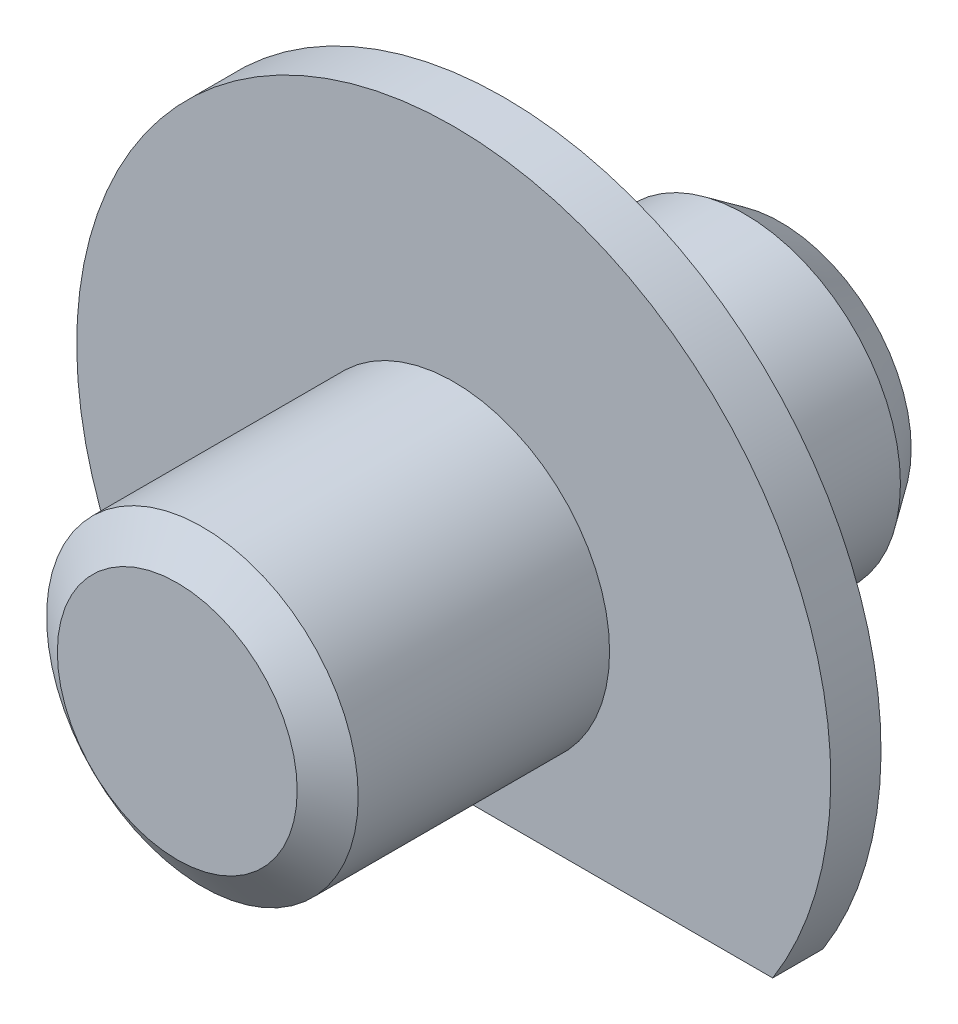
ISO-10303-21;
HEADER;
FILE_DESCRIPTION(('STEP AP214'),'2;1');
FILE_NAME('part.step','',(''),(''),'','','');
FILE_SCHEMA(('AUTOMOTIVE_DESIGN { 1 0 10303 214 1 1 1 1 }'));
ENDSEC;
DATA;
#1=APPLICATION_CONTEXT('core data for automotive mechanical design processes');
#2=APPLICATION_PROTOCOL_DEFINITION('international standard','automotive_design',2000,#1);
#3=PRODUCT_CONTEXT('',#1,'mechanical');
#4=PRODUCT('Part','Part','',(#3));
#5=PRODUCT_RELATED_PRODUCT_CATEGORY('part','',(#4));
#6=PRODUCT_DEFINITION_FORMATION('','',#4);
#7=PRODUCT_DEFINITION_CONTEXT('part definition',#1,'design');
#8=PRODUCT_DEFINITION('design','',#6,#7);
#9=PRODUCT_DEFINITION_SHAPE('','',#8);
#10=(LENGTH_UNIT() NAMED_UNIT(*) SI_UNIT(.MILLI.,.METRE.));
#11=(NAMED_UNIT(*) PLANE_ANGLE_UNIT() SI_UNIT($,.RADIAN.));
#12=(NAMED_UNIT(*) SI_UNIT($,.STERADIAN.) SOLID_ANGLE_UNIT());
#13=UNCERTAINTY_MEASURE_WITH_UNIT(LENGTH_MEASURE(1.E-05),#10,'distance_accuracy_value','');
#14=(GEOMETRIC_REPRESENTATION_CONTEXT(3) GLOBAL_UNCERTAINTY_ASSIGNED_CONTEXT((#13)) GLOBAL_UNIT_ASSIGNED_CONTEXT((#10,
#11,#12)) REPRESENTATION_CONTEXT('',''));
#15=CARTESIAN_POINT('',(0.,0.,0.));
#16=DIRECTION('',(0.,0.,1.));
#17=DIRECTION('',(1.,0.,0.));
#18=AXIS2_PLACEMENT_3D('',#15,#16,#17);
#19=CARTESIAN_POINT('',(0.,0.,12.));
#20=DIRECTION('',(0.,0.,-1.));
#21=DIRECTION('',(-1.,0.,0.));
#22=AXIS2_PLACEMENT_3D('',#19,#20,#21);
#23=CYLINDRICAL_SURFACE('',#22,3.1);
#24=CARTESIAN_POINT('',(0.,0.,0.714074003371056));
#25=DIRECTION('',(0.,0.,1.));
#26=DIRECTION('',(1.,0.,0.));
#27=AXIS2_PLACEMENT_3D('',#24,#25,#26);
#28=CIRCLE('',#27,3.1);
#29=CARTESIAN_POINT('',(3.1,0.,0.714074003371056));
#30=VERTEX_POINT('',#29);
#31=EDGE_CURVE('E85',#30,#30,#28,.T.);
#32=ORIENTED_EDGE('',*,*,#31,.T.);
#33=EDGE_LOOP('',(#32));
#34=FACE_BOUND('',#33,.T.);
#35=CARTESIAN_POINT('',(0.,0.,5.5));
#36=DIRECTION('',(0.,0.,1.));
#37=DIRECTION('',(1.,0.,0.));
#38=AXIS2_PLACEMENT_3D('',#35,#36,#37);
#39=CIRCLE('',#38,3.1);
#40=CARTESIAN_POINT('',(3.1,0.,5.5));
#41=VERTEX_POINT('',#40);
#42=EDGE_CURVE('E11',#41,#41,#39,.T.);
#43=ORIENTED_EDGE('',*,*,#42,.F.);
#44=EDGE_LOOP('',(#43));
#45=FACE_BOUND('',#44,.T.);
#46=ADVANCED_FACE('F36',(#34,#45),#23,.T.);
#47=CARTESIAN_POINT('',(0.,0.,0.));
#48=DIRECTION('',(0.,0.,1.));
#49=DIRECTION('',(1.,0.,0.));
#50=AXIS2_PLACEMENT_3D('',#47,#48,#49);
#51=PLANE('',#50);
#52=CARTESIAN_POINT('',(0.,0.,0.));
#53=DIRECTION('',(0.,0.,1.));
#54=DIRECTION('',(1.,0.,0.));
#55=AXIS2_PLACEMENT_3D('',#52,#53,#54);
#56=CIRCLE('',#55,2.6);
#57=CARTESIAN_POINT('',(2.6,0.,0.));
#58=VERTEX_POINT('',#57);
#59=EDGE_CURVE('E88',#58,#58,#56,.F.);
#60=ORIENTED_EDGE('',*,*,#59,.T.);
#61=EDGE_LOOP('',(#60));
#62=FACE_BOUND('',#61,.T.);
#63=ADVANCED_FACE('F111',(#62),#51,.F.);
#64=CARTESIAN_POINT('',(0.,0.,0.714074003371056));
#65=DIRECTION('',(0.,0.,1.));
#66=DIRECTION('',(1.,0.,0.));
#67=AXIS2_PLACEMENT_3D('',#64,#65,#66);
#68=CONICAL_SURFACE('',#67,3.1,0.610865238198017);
#69=ORIENTED_EDGE('',*,*,#59,.F.);
#70=EDGE_LOOP('',(#69));
#71=FACE_BOUND('',#70,.T.);
#72=ORIENTED_EDGE('',*,*,#31,.F.);
#73=EDGE_LOOP('',(#72));
#74=FACE_BOUND('',#73,.T.);
#75=ADVANCED_FACE('F117',(#71,#74),#68,.T.);
#76=CARTESIAN_POINT('',(0.,0.,5.5));
#77=DIRECTION('',(0.,0.,1.));
#78=DIRECTION('',(1.,0.,0.));
#79=AXIS2_PLACEMENT_3D('',#76,#77,#78);
#80=CYLINDRICAL_SURFACE('',#79,7.5);
#81=DIRECTION('',(0.,0.,1.));
#82=VECTOR('',#81,1.);
#83=CARTESIAN_POINT('',(-6.34428877022476,-4.,5.5));
#84=LINE('',#83,#82);
#85=CARTESIAN_POINT('',(-6.34428877022476,-4.,5.5));
#86=VERTEX_POINT('',#85);
#87=CARTESIAN_POINT('',(-6.34428877022476,-4.,6.5));
#88=VERTEX_POINT('',#87);
#89=EDGE_CURVE('E59',#86,#88,#84,.T.);
#90=ORIENTED_EDGE('',*,*,#89,.T.);
#91=CARTESIAN_POINT('',(0.,0.,6.5));
#92=DIRECTION('',(0.,0.,1.));
#93=DIRECTION('',(1.,0.,0.));
#94=AXIS2_PLACEMENT_3D('',#91,#92,#93);
#95=CIRCLE('',#94,7.5);
#96=CARTESIAN_POINT('',(6.34428877022476,-4.,6.5));
#97=VERTEX_POINT('',#96);
#98=EDGE_CURVE('E65',#97,#88,#95,.T.);
#99=ORIENTED_EDGE('',*,*,#98,.F.);
#100=DIRECTION('',(0.,0.,1.));
#101=VECTOR('',#100,1.);
#102=CARTESIAN_POINT('',(6.34428877022476,-4.,5.5));
#103=LINE('',#102,#101);
#104=CARTESIAN_POINT('',(6.34428877022476,-4.,5.5));
#105=VERTEX_POINT('',#104);
#106=EDGE_CURVE('E51',#105,#97,#103,.T.);
#107=ORIENTED_EDGE('',*,*,#106,.F.);
#108=CARTESIAN_POINT('',(0.,0.,5.5));
#109=DIRECTION('',(0.,0.,1.));
#110=DIRECTION('',(1.,0.,0.));
#111=AXIS2_PLACEMENT_3D('',#108,#109,#110);
#112=CIRCLE('',#111,7.5);
#113=EDGE_CURVE('E66',#105,#86,#112,.T.);
#114=ORIENTED_EDGE('',*,*,#113,.T.);
#115=EDGE_LOOP('',(#90,#99,#107,#114));
#116=FACE_BOUND('',#115,.T.);
#117=ADVANCED_FACE('F63',(#116),#80,.T.);
#118=CARTESIAN_POINT('',(-6.34428877022476,-4.,5.5));
#119=DIRECTION('',(0.,-1.,0.));
#120=DIRECTION('',(0.,0.,-1.));
#121=AXIS2_PLACEMENT_3D('',#118,#119,#120);
#122=PLANE('',#121);
#123=ORIENTED_EDGE('',*,*,#106,.T.);
#124=DIRECTION('',(1.,0.,0.));
#125=VECTOR('',#124,1.);
#126=CARTESIAN_POINT('',(-6.34428877022476,-4.,6.5));
#127=LINE('',#126,#125);
#128=EDGE_CURVE('E71',#88,#97,#127,.T.);
#129=ORIENTED_EDGE('',*,*,#128,.F.);
#130=ORIENTED_EDGE('',*,*,#89,.F.);
#131=DIRECTION('',(1.,0.,0.));
#132=VECTOR('',#131,1.);
#133=CARTESIAN_POINT('',(-6.34428877022476,-4.,5.5));
#134=LINE('',#133,#132);
#135=EDGE_CURVE('E68',#86,#105,#134,.T.);
#136=ORIENTED_EDGE('',*,*,#135,.T.);
#137=EDGE_LOOP('',(#123,#129,#130,#136));
#138=FACE_BOUND('',#137,.T.);
#139=ADVANCED_FACE('F72',(#138),#122,.T.);
#140=CARTESIAN_POINT('',(0.,0.,5.5));
#141=DIRECTION('',(0.,0.,1.));
#142=DIRECTION('',(1.,0.,0.));
#143=AXIS2_PLACEMENT_3D('',#140,#141,#142);
#144=PLANE('',#143);
#145=ORIENTED_EDGE('',*,*,#42,.T.);
#146=EDGE_LOOP('',(#145));
#147=FACE_BOUND('',#146,.T.);
#148=ORIENTED_EDGE('',*,*,#113,.F.);
#149=ORIENTED_EDGE('',*,*,#135,.F.);
#150=EDGE_LOOP('',(#148,#149));
#151=FACE_BOUND('',#150,.T.);
#152=ADVANCED_FACE('F100',(#147,#151),#144,.F.);
#153=CARTESIAN_POINT('',(0.,0.,6.5));
#154=DIRECTION('',(0.,0.,1.));
#155=DIRECTION('',(1.,0.,0.));
#156=AXIS2_PLACEMENT_3D('',#153,#154,#155);
#157=PLANE('',#156);
#158=CARTESIAN_POINT('',(0.,0.,6.5));
#159=DIRECTION('',(0.,0.,1.));
#160=DIRECTION('',(1.,0.,0.));
#161=AXIS2_PLACEMENT_3D('',#158,#159,#160);
#162=CIRCLE('',#161,3.1);
#163=CARTESIAN_POINT('',(3.1,0.,6.5));
#164=VERTEX_POINT('',#163);
#165=EDGE_CURVE('E80',#164,#164,#162,.T.);
#166=ORIENTED_EDGE('',*,*,#165,.F.);
#167=EDGE_LOOP('',(#166));
#168=FACE_BOUND('',#167,.T.);
#169=ORIENTED_EDGE('',*,*,#98,.T.);
#170=ORIENTED_EDGE('',*,*,#128,.T.);
#171=EDGE_LOOP('',(#169,#170));
#172=FACE_BOUND('',#171,.T.);
#173=ADVANCED_FACE('F75',(#168,#172),#157,.T.);
#174=CARTESIAN_POINT('',(0.,0.,12.));
#175=DIRECTION('',(0.,0.,1.));
#176=DIRECTION('',(1.,0.,0.));
#177=AXIS2_PLACEMENT_3D('',#174,#175,#176);
#178=PLANE('',#177);
#179=CARTESIAN_POINT('',(0.,0.,12.));
#180=DIRECTION('',(0.,0.,1.));
#181=DIRECTION('',(1.,0.,0.));
#182=AXIS2_PLACEMENT_3D('',#179,#180,#181);
#183=CIRCLE('',#182,2.38592599662895);
#184=CARTESIAN_POINT('',(2.38592599662895,0.,12.));
#185=VERTEX_POINT('',#184);
#186=EDGE_CURVE('E44',#185,#185,#183,.T.);
#187=ORIENTED_EDGE('',*,*,#186,.T.);
#188=EDGE_LOOP('',(#187));
#189=FACE_BOUND('',#188,.T.);
#190=ADVANCED_FACE('F99',(#189),#178,.T.);
#191=CARTESIAN_POINT('',(0.,0.,12.));
#192=DIRECTION('',(0.,0.,-1.));
#193=DIRECTION('',(-1.,0.,0.));
#194=AXIS2_PLACEMENT_3D('',#191,#192,#193);
#195=CONICAL_SURFACE('',#194,2.38592599662895,0.95993108859688);
#196=CARTESIAN_POINT('',(0.,0.,11.5));
#197=DIRECTION('',(0.,0.,1.));
#198=DIRECTION('',(1.,0.,0.));
#199=AXIS2_PLACEMENT_3D('',#196,#197,#198);
#200=CIRCLE('',#199,3.1);
#201=CARTESIAN_POINT('',(3.1,0.,11.5));
#202=VERTEX_POINT('',#201);
#203=EDGE_CURVE('E82',#202,#202,#200,.F.);
#204=ORIENTED_EDGE('',*,*,#203,.F.);
#205=EDGE_LOOP('',(#204));
#206=FACE_BOUND('',#205,.T.);
#207=ORIENTED_EDGE('',*,*,#186,.F.);
#208=EDGE_LOOP('',(#207));
#209=FACE_BOUND('',#208,.T.);
#210=ADVANCED_FACE('F38',(#206,#209),#195,.T.);
#211=ORIENTED_EDGE('',*,*,#165,.T.);
#212=EDGE_LOOP('',(#211));
#213=FACE_BOUND('',#212,.T.);
#214=ORIENTED_EDGE('',*,*,#203,.T.);
#215=EDGE_LOOP('',(#214));
#216=FACE_BOUND('',#215,.T.);
#217=ADVANCED_FACE('F95',(#213,#216),#23,.T.);
#218=CLOSED_SHELL('',(#46,#63,#75,#117,#139,#152,#173,#190,#210,#217));
#219=MANIFOLD_SOLID_BREP('B2',#218);
#220=ADVANCED_BREP_SHAPE_REPRESENTATION('',(#18,#219),#14);
#221=SHAPE_DEFINITION_REPRESENTATION(#9,#220);
ENDSEC;
END-ISO-10303-21;
